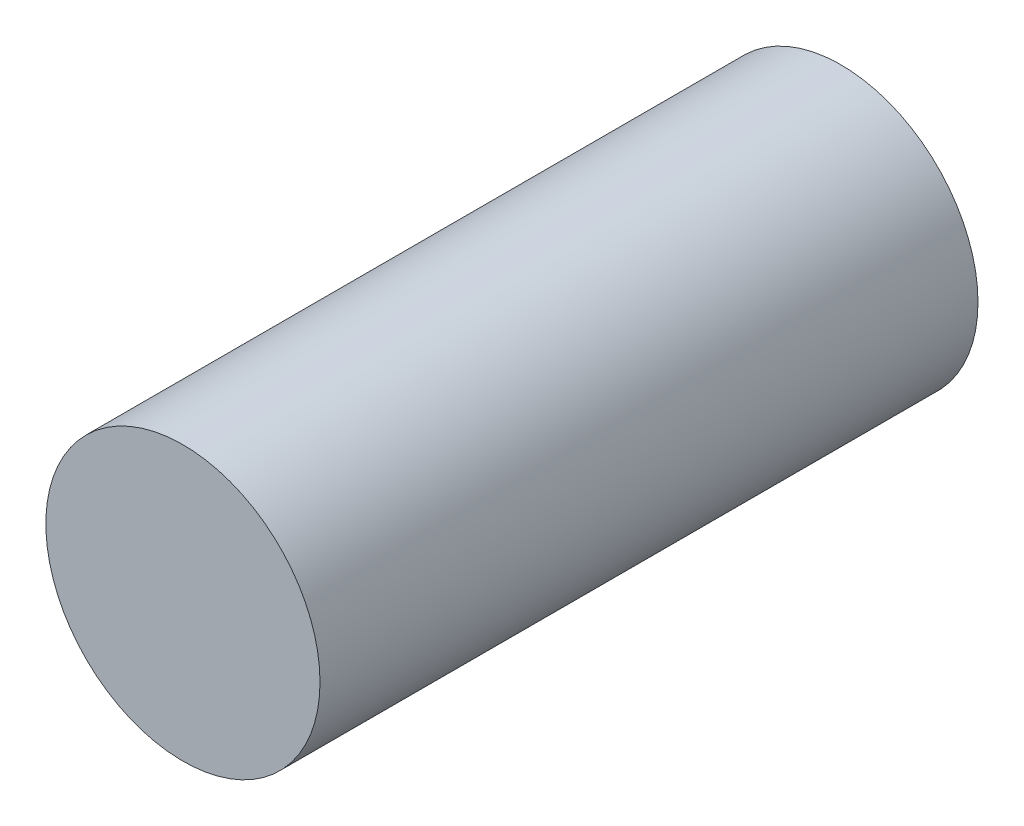
ISO-10303-21;
HEADER;
FILE_DESCRIPTION(('STEP AP214'),'2;1');
FILE_NAME('part.step','',(''),(''),'','','');
FILE_SCHEMA(('AUTOMOTIVE_DESIGN { 1 0 10303 214 1 1 1 1 }'));
ENDSEC;
DATA;
#1=APPLICATION_CONTEXT('core data for automotive mechanical design processes');
#2=APPLICATION_PROTOCOL_DEFINITION('international standard','automotive_design',2000,#1);
#3=PRODUCT_CONTEXT('',#1,'mechanical');
#4=PRODUCT('Part','Part','',(#3));
#5=PRODUCT_RELATED_PRODUCT_CATEGORY('part','',(#4));
#6=PRODUCT_DEFINITION_FORMATION('','',#4);
#7=PRODUCT_DEFINITION_CONTEXT('part definition',#1,'design');
#8=PRODUCT_DEFINITION('design','',#6,#7);
#9=PRODUCT_DEFINITION_SHAPE('','',#8);
#10=(LENGTH_UNIT() NAMED_UNIT(*) SI_UNIT(.MILLI.,.METRE.));
#11=(NAMED_UNIT(*) PLANE_ANGLE_UNIT() SI_UNIT($,.RADIAN.));
#12=(NAMED_UNIT(*) SI_UNIT($,.STERADIAN.) SOLID_ANGLE_UNIT());
#13=UNCERTAINTY_MEASURE_WITH_UNIT(LENGTH_MEASURE(1.E-05),#10,'distance_accuracy_value','');
#14=(GEOMETRIC_REPRESENTATION_CONTEXT(3) GLOBAL_UNCERTAINTY_ASSIGNED_CONTEXT((#13)) GLOBAL_UNIT_ASSIGNED_CONTEXT((#10,
#11,#12)) REPRESENTATION_CONTEXT('',''));
#15=CARTESIAN_POINT('',(0.,0.,0.));
#16=DIRECTION('',(0.,0.,1.));
#17=DIRECTION('',(1.,0.,0.));
#18=AXIS2_PLACEMENT_3D('',#15,#16,#17);
#19=CARTESIAN_POINT('',(0.,0.,24.));
#20=DIRECTION('',(0.,0.,-1.));
#21=DIRECTION('',(-1.,0.,0.));
#22=AXIS2_PLACEMENT_3D('',#19,#20,#21);
#23=CYLINDRICAL_SURFACE('',#22,5.);
#24=CARTESIAN_POINT('',(0.,0.,24.));
#25=DIRECTION('',(0.,0.,1.));
#26=DIRECTION('',(1.,0.,0.));
#27=AXIS2_PLACEMENT_3D('',#24,#25,#26);
#28=CIRCLE('',#27,5.);
#29=CARTESIAN_POINT('',(5.,0.,24.));
#30=VERTEX_POINT('',#29);
#31=EDGE_CURVE('E10',#30,#30,#28,.T.);
#32=ORIENTED_EDGE('',*,*,#31,.F.);
#33=EDGE_LOOP('',(#32));
#34=FACE_BOUND('',#33,.T.);
#35=CARTESIAN_POINT('',(0.,0.,0.));
#36=DIRECTION('',(0.,0.,1.));
#37=DIRECTION('',(1.,0.,0.));
#38=AXIS2_PLACEMENT_3D('',#35,#36,#37);
#39=CIRCLE('',#38,5.);
#40=CARTESIAN_POINT('',(5.,0.,0.));
#41=VERTEX_POINT('',#40);
#42=EDGE_CURVE('E45',#41,#41,#39,.T.);
#43=ORIENTED_EDGE('',*,*,#42,.T.);
#44=EDGE_LOOP('',(#43));
#45=FACE_BOUND('',#44,.T.);
#46=ADVANCED_FACE('F39',(#34,#45),#23,.T.);
#47=CARTESIAN_POINT('',(0.,0.,24.));
#48=DIRECTION('',(0.,0.,1.));
#49=DIRECTION('',(1.,0.,0.));
#50=AXIS2_PLACEMENT_3D('',#47,#48,#49);
#51=PLANE('',#50);
#52=ORIENTED_EDGE('',*,*,#31,.T.);
#53=EDGE_LOOP('',(#52));
#54=FACE_BOUND('',#53,.T.);
#55=ADVANCED_FACE('F53',(#54),#51,.T.);
#56=CARTESIAN_POINT('',(0.,0.,0.));
#57=DIRECTION('',(0.,0.,1.));
#58=DIRECTION('',(1.,0.,0.));
#59=AXIS2_PLACEMENT_3D('',#56,#57,#58);
#60=PLANE('',#59);
#61=ORIENTED_EDGE('',*,*,#42,.F.);
#62=EDGE_LOOP('',(#61));
#63=FACE_BOUND('',#62,.T.);
#64=ADVANCED_FACE('F55',(#63),#60,.F.);
#65=CLOSED_SHELL('',(#46,#55,#64));
#66=MANIFOLD_SOLID_BREP('B2',#65);
#67=ADVANCED_BREP_SHAPE_REPRESENTATION('',(#18,#66),#14);
#68=SHAPE_DEFINITION_REPRESENTATION(#9,#67);
ENDSEC;
END-ISO-10303-21;
